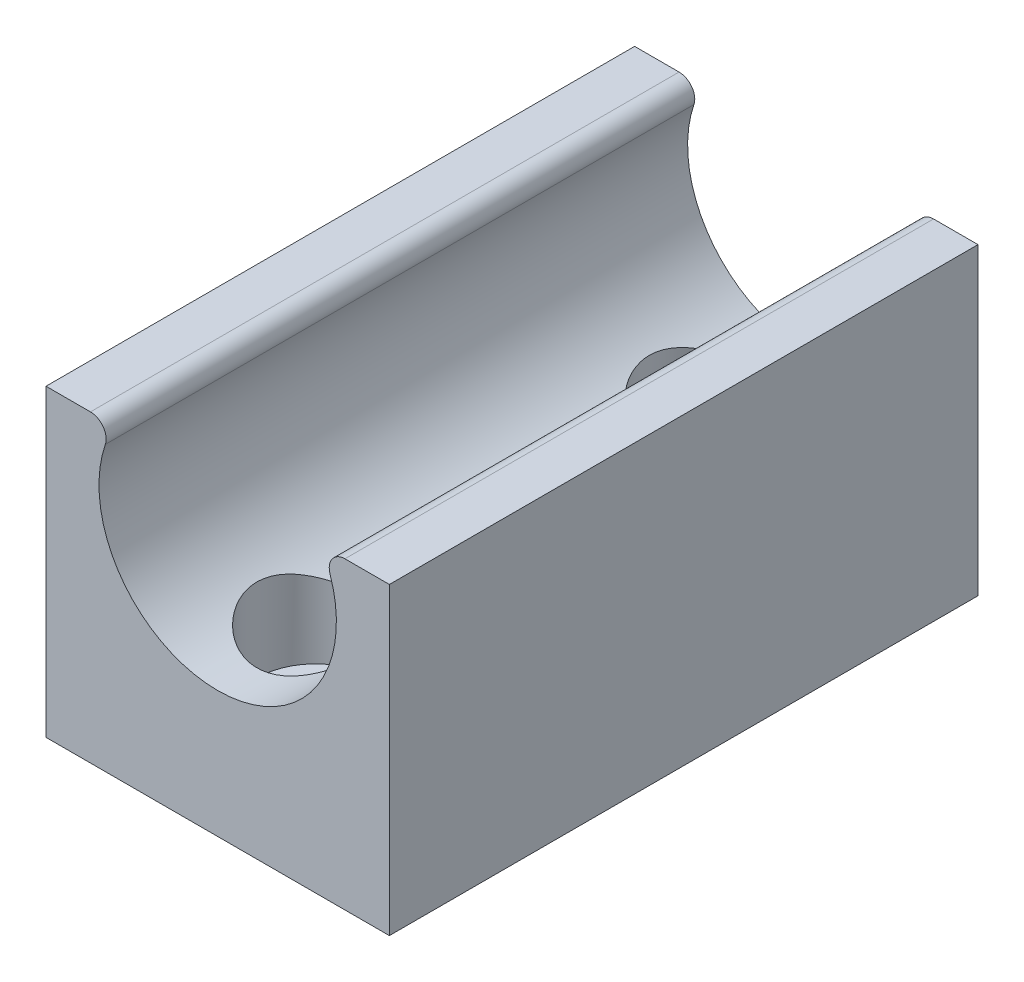
ISO-10303-21;
HEADER;
FILE_DESCRIPTION(('STEP AP214'),'2;1');
FILE_NAME('part.step','',(''),(''),'','','');
FILE_SCHEMA(('AUTOMOTIVE_DESIGN { 1 0 10303 214 1 1 1 1 }'));
ENDSEC;
DATA;
#1=APPLICATION_CONTEXT('core data for automotive mechanical design processes');
#2=APPLICATION_PROTOCOL_DEFINITION('international standard','automotive_design',2000,#1);
#3=PRODUCT_CONTEXT('',#1,'mechanical');
#4=PRODUCT('Part','Part','',(#3));
#5=PRODUCT_RELATED_PRODUCT_CATEGORY('part','',(#4));
#6=PRODUCT_DEFINITION_FORMATION('','',#4);
#7=PRODUCT_DEFINITION_CONTEXT('part definition',#1,'design');
#8=PRODUCT_DEFINITION('design','',#6,#7);
#9=PRODUCT_DEFINITION_SHAPE('','',#8);
#10=(LENGTH_UNIT() NAMED_UNIT(*) SI_UNIT(.MILLI.,.METRE.));
#11=(NAMED_UNIT(*) PLANE_ANGLE_UNIT() SI_UNIT($,.RADIAN.));
#12=(NAMED_UNIT(*) SI_UNIT($,.STERADIAN.) SOLID_ANGLE_UNIT());
#13=UNCERTAINTY_MEASURE_WITH_UNIT(LENGTH_MEASURE(1.E-05),#10,'distance_accuracy_value','');
#14=(GEOMETRIC_REPRESENTATION_CONTEXT(3) GLOBAL_UNCERTAINTY_ASSIGNED_CONTEXT((#13)) GLOBAL_UNIT_ASSIGNED_CONTEXT((#10,
#11,#12)) REPRESENTATION_CONTEXT('',''));
#15=CARTESIAN_POINT('',(0.,0.,0.));
#16=DIRECTION('',(0.,0.,1.));
#17=DIRECTION('',(1.,0.,0.));
#18=AXIS2_PLACEMENT_3D('',#15,#16,#17);
#19=CARTESIAN_POINT('',(-8.75,-7.75,30.));
#20=DIRECTION('',(1.,0.,0.));
#21=DIRECTION('',(0.,0.,-1.));
#22=AXIS2_PLACEMENT_3D('',#19,#20,#21);
#23=PLANE('',#22);
#24=DIRECTION('',(0.,-1.,0.));
#25=VECTOR('',#24,1.);
#26=CARTESIAN_POINT('',(-8.75,-7.75,0.));
#27=LINE('',#26,#25);
#28=CARTESIAN_POINT('',(-8.75,7.75,0.));
#29=VERTEX_POINT('',#28);
#30=CARTESIAN_POINT('',(-8.75,-7.75,0.));
#31=VERTEX_POINT('',#30);
#32=EDGE_CURVE('E128',#29,#31,#27,.T.);
#33=ORIENTED_EDGE('',*,*,#32,.T.);
#34=DIRECTION('',(0.,0.,-1.));
#35=VECTOR('',#34,1.);
#36=CARTESIAN_POINT('',(-8.75,-7.75,30.));
#37=LINE('',#36,#35);
#38=CARTESIAN_POINT('',(-8.75,-7.75,30.));
#39=VERTEX_POINT('',#38);
#40=EDGE_CURVE('E111',#39,#31,#37,.T.);
#41=ORIENTED_EDGE('',*,*,#40,.F.);
#42=DIRECTION('',(0.,-1.,0.));
#43=VECTOR('',#42,1.);
#44=CARTESIAN_POINT('',(-8.75,-7.75,30.));
#45=LINE('',#44,#43);
#46=CARTESIAN_POINT('',(-8.75,7.75,30.));
#47=VERTEX_POINT('',#46);
#48=EDGE_CURVE('E117',#47,#39,#45,.T.);
#49=ORIENTED_EDGE('',*,*,#48,.F.);
#50=DIRECTION('',(0.,0.,-1.));
#51=VECTOR('',#50,1.);
#52=CARTESIAN_POINT('',(-8.75,7.75,30.));
#53=LINE('',#52,#51);
#54=EDGE_CURVE('E210',#47,#29,#53,.T.);
#55=ORIENTED_EDGE('',*,*,#54,.T.);
#56=EDGE_LOOP('',(#33,#41,#49,#55));
#57=FACE_BOUND('',#56,.T.);
#58=ADVANCED_FACE('F37',(#57),#23,.F.);
#59=CARTESIAN_POINT('',(8.75,-7.75,30.));
#60=DIRECTION('',(0.,1.,0.));
#61=DIRECTION('',(-1.,0.,0.));
#62=AXIS2_PLACEMENT_3D('',#59,#60,#61);
#63=PLANE('',#62);
#64=CARTESIAN_POINT('',(0.,-7.75,5.));
#65=DIRECTION('',(0.,1.,0.));
#66=DIRECTION('',(-1.,0.,0.));
#67=AXIS2_PLACEMENT_3D('',#64,#65,#66);
#68=CIRCLE('',#67,1.55);
#69=CARTESIAN_POINT('',(-1.55,-7.75,5.));
#70=VERTEX_POINT('',#69);
#71=EDGE_CURVE('E241',#70,#70,#68,.T.);
#72=ORIENTED_EDGE('',*,*,#71,.T.);
#73=EDGE_LOOP('',(#72));
#74=FACE_BOUND('',#73,.T.);
#75=CARTESIAN_POINT('',(0.,-7.75,25.));
#76=DIRECTION('',(0.,1.,0.));
#77=DIRECTION('',(-1.,0.,0.));
#78=AXIS2_PLACEMENT_3D('',#75,#76,#77);
#79=CIRCLE('',#78,1.55);
#80=CARTESIAN_POINT('',(-1.55,-7.75,25.));
#81=VERTEX_POINT('',#80);
#82=EDGE_CURVE('E238',#81,#81,#79,.T.);
#83=ORIENTED_EDGE('',*,*,#82,.T.);
#84=EDGE_LOOP('',(#83));
#85=FACE_BOUND('',#84,.T.);
#86=DIRECTION('',(1.,0.,0.));
#87=VECTOR('',#86,1.);
#88=CARTESIAN_POINT('',(8.75,-7.75,0.));
#89=LINE('',#88,#87);
#90=CARTESIAN_POINT('',(8.75,-7.75,0.));
#91=VERTEX_POINT('',#90);
#92=EDGE_CURVE('E216',#31,#91,#89,.T.);
#93=ORIENTED_EDGE('',*,*,#92,.T.);
#94=DIRECTION('',(0.,0.,-1.));
#95=VECTOR('',#94,1.);
#96=CARTESIAN_POINT('',(8.75,-7.75,30.));
#97=LINE('',#96,#95);
#98=CARTESIAN_POINT('',(8.75,-7.75,30.));
#99=VERTEX_POINT('',#98);
#100=EDGE_CURVE('E114',#99,#91,#97,.T.);
#101=ORIENTED_EDGE('',*,*,#100,.F.);
#102=DIRECTION('',(1.,0.,0.));
#103=VECTOR('',#102,1.);
#104=CARTESIAN_POINT('',(8.75,-7.75,30.));
#105=LINE('',#104,#103);
#106=EDGE_CURVE('E107',#39,#99,#105,.T.);
#107=ORIENTED_EDGE('',*,*,#106,.F.);
#108=ORIENTED_EDGE('',*,*,#40,.T.);
#109=EDGE_LOOP('',(#93,#101,#107,#108));
#110=FACE_BOUND('',#109,.T.);
#111=ADVANCED_FACE('F109',(#74,#85,#110),#63,.F.);
#112=CARTESIAN_POINT('',(8.75,-7.75,30.));
#113=DIRECTION('',(-1.,0.,0.));
#114=DIRECTION('',(0.,0.,1.));
#115=AXIS2_PLACEMENT_3D('',#112,#113,#114);
#116=PLANE('',#115);
#117=DIRECTION('',(0.,1.,0.));
#118=VECTOR('',#117,1.);
#119=CARTESIAN_POINT('',(8.75,-7.75,0.));
#120=LINE('',#119,#118);
#121=CARTESIAN_POINT('',(8.75,7.75,0.));
#122=VERTEX_POINT('',#121);
#123=EDGE_CURVE('E218',#91,#122,#120,.T.);
#124=ORIENTED_EDGE('',*,*,#123,.T.);
#125=DIRECTION('',(0.,0.,-1.));
#126=VECTOR('',#125,1.);
#127=CARTESIAN_POINT('',(8.75,7.75,30.));
#128=LINE('',#127,#126);
#129=CARTESIAN_POINT('',(8.75,7.75,30.));
#130=VERTEX_POINT('',#129);
#131=EDGE_CURVE('E133',#130,#122,#128,.T.);
#132=ORIENTED_EDGE('',*,*,#131,.F.);
#133=DIRECTION('',(0.,1.,0.));
#134=VECTOR('',#133,1.);
#135=CARTESIAN_POINT('',(8.75,-7.75,30.));
#136=LINE('',#135,#134);
#137=EDGE_CURVE('E116',#99,#130,#136,.T.);
#138=ORIENTED_EDGE('',*,*,#137,.F.);
#139=ORIENTED_EDGE('',*,*,#100,.T.);
#140=EDGE_LOOP('',(#124,#132,#138,#139));
#141=FACE_BOUND('',#140,.T.);
#142=ADVANCED_FACE('F190',(#141),#116,.F.);
#143=CARTESIAN_POINT('',(8.75,7.75,30.));
#144=DIRECTION('',(0.,-1.,0.));
#145=DIRECTION('',(1.,0.,0.));
#146=AXIS2_PLACEMENT_3D('',#143,#144,#145);
#147=PLANE('',#146);
#148=DIRECTION('',(-1.,0.,0.));
#149=VECTOR('',#148,1.);
#150=CARTESIAN_POINT('',(8.75,7.75,0.));
#151=LINE('',#150,#149);
#152=CARTESIAN_POINT('',(6.48484038670801,7.75,0.));
#153=VERTEX_POINT('',#152);
#154=EDGE_CURVE('E220',#122,#153,#151,.T.);
#155=ORIENTED_EDGE('',*,*,#154,.T.);
#156=DIRECTION('',(0.,0.,-1.));
#157=VECTOR('',#156,1.);
#158=CARTESIAN_POINT('',(6.48484038670801,7.75,30.));
#159=LINE('',#158,#157);
#160=CARTESIAN_POINT('',(6.48484038670801,7.75,30.));
#161=VERTEX_POINT('',#160);
#162=EDGE_CURVE('E62',#153,#161,#159,.F.);
#163=ORIENTED_EDGE('',*,*,#162,.T.);
#164=DIRECTION('',(-1.,0.,0.));
#165=VECTOR('',#164,1.);
#166=CARTESIAN_POINT('',(8.75,7.75,30.));
#167=LINE('',#166,#165);
#168=EDGE_CURVE('E204',#130,#161,#167,.T.);
#169=ORIENTED_EDGE('',*,*,#168,.F.);
#170=ORIENTED_EDGE('',*,*,#131,.T.);
#171=EDGE_LOOP('',(#155,#163,#169,#170));
#172=FACE_BOUND('',#171,.T.);
#173=ADVANCED_FACE('F183',(#172),#147,.F.);
#174=CARTESIAN_POINT('',(0.,4.74334072432542,30.));
#175=DIRECTION('',(0.,0.,-1.));
#176=DIRECTION('',(-1.,0.,0.));
#177=AXIS2_PLACEMENT_3D('',#174,#175,#176);
#178=CYLINDRICAL_SURFACE('',#177,6.05);
#179=CARTESIAN_POINT('',(-3.,-0.510467418345945,5.));
#180=CARTESIAN_POINT('',(-2.99999906809474,-0.510468420860445,4.92169958919087));
#181=CARTESIAN_POINT('',(-2.99692823095395,-0.512225857019895,4.8433884027717));
#182=CARTESIAN_POINT('',(-2.98469593638342,-0.519180558374638,4.68738634838371));
#183=CARTESIAN_POINT('',(-2.97553158010728,-0.524379460760186,4.60969579347636));
#184=CARTESIAN_POINT('',(-2.93900669661293,-0.544908680843851,4.37823264692065));
#185=CARTESIAN_POINT('',(-2.90261462142551,-0.565171017829793,4.22621080798807));
#186=CARTESIAN_POINT('',(-2.80775426000344,-0.615934930005664,3.93213582389355));
#187=CARTESIAN_POINT('',(-2.7494018083673,-0.646382688012097,3.79003493192759));
#188=CARTESIAN_POINT('',(-2.6126308262436,-0.713991040877364,3.51764153154145));
#189=CARTESIAN_POINT('',(-2.53421149634938,-0.751151903149601,3.38734949383212));
#190=CARTESIAN_POINT('',(-2.35207791908091,-0.831684826026814,3.13065008506965));
#191=CARTESIAN_POINT('',(-2.24682870416992,-0.875316190133694,3.0054133867091));
#192=CARTESIAN_POINT('',(-2.01721665974256,-0.961778990100263,2.77345914021974));
#193=CARTESIAN_POINT('',(-1.89284448548842,-1.00461002332697,2.66675070079675));
#194=CARTESIAN_POINT('',(-1.6184786687261,-1.08803015934491,2.46799246796855));
#195=CARTESIAN_POINT('',(-1.46733550477812,-1.12828449124294,2.37737580991346));
#196=CARTESIAN_POINT('',(-1.14958038611186,-1.19865972325338,2.22338801387059));
#197=CARTESIAN_POINT('',(-0.982978114604601,-1.22878691281416,2.15999995877159));
#198=CARTESIAN_POINT('',(-0.651423860859738,-1.27364660956282,2.06688241456696));
#199=CARTESIAN_POINT('',(-0.487176521968722,-1.28931108372145,2.035103075595));
#200=CARTESIAN_POINT('',(-0.15499131346126,-1.30695497814249,1.99936086132741));
#201=CARTESIAN_POINT('',(0.0129443057167113,-1.30894252289321,1.99538147204299));
#202=CARTESIAN_POINT('',(0.332354445423705,-1.29945611499654,2.0145461562578));
#203=CARTESIAN_POINT('',(0.484007962523601,-1.28911942101921,2.035398591201));
#204=CARTESIAN_POINT('',(0.781333146292697,-1.25785659100831,2.09954285160153));
#205=CARTESIAN_POINT('',(0.927004365054746,-1.23692966361902,2.14283635397461));
#206=CARTESIAN_POINT('',(1.21079360349512,-1.18604146430231,2.25093276304642));
#207=CARTESIAN_POINT('',(1.3487772176401,-1.15595773393687,2.31602850637883));
#208=CARTESIAN_POINT('',(1.61219900252273,-1.08947997144428,2.46548322192162));
#209=CARTESIAN_POINT('',(1.73763263516921,-1.05308366959321,2.5498491263071));
#210=CARTESIAN_POINT('',(1.98489139887648,-0.973399023566615,2.74451485261607));
#211=CARTESIAN_POINT('',(2.10528603368982,-0.929784470629818,2.85650064321701));
#212=CARTESIAN_POINT('',(2.32634259539988,-0.84278218002394,3.09866712688479));
#213=CARTESIAN_POINT('',(2.42698977332746,-0.799394635265103,3.22886129604987));
#214=CARTESIAN_POINT('',(2.61181236808333,-0.714856277507947,3.51375228475325));
#215=CARTESIAN_POINT('',(2.69458875370377,-0.674008529712046,3.66946515757608));
#216=CARTESIAN_POINT('',(2.79773152700655,-0.621050067610582,3.91347968465842));
#217=CARTESIAN_POINT('',(2.82861305914927,-0.604780250734139,3.99657713022711));
#218=CARTESIAN_POINT('',(2.88302399044353,-0.57564672861484,4.16570628855268));
#219=CARTESIAN_POINT('',(2.90655788697889,-0.562780940552876,4.25173617049391));
#220=CARTESIAN_POINT('',(2.94439298418655,-0.541872606173172,4.41919564061344));
#221=CARTESIAN_POINT('',(2.95927300565854,-0.533531185379414,4.50045769692463));
#222=CARTESIAN_POINT('',(2.98229098239219,-0.52055666332928,4.66418766032683));
#223=CARTESIAN_POINT('',(2.99043241562099,-0.515921649138391,4.74665492298273));
#224=CARTESIAN_POINT('',(2.99985479803174,-0.510553378553936,4.9120840314402));
#225=CARTESIAN_POINT('',(3.00113816073897,-0.509818749518585,4.99504569295921));
#226=CARTESIAN_POINT('',(2.99683992542914,-0.512270371357852,5.16070691994721));
#227=CARTESIAN_POINT('',(2.99125877282282,-0.515456367838882,5.24340650207241));
#228=CARTESIAN_POINT('',(2.96623633903531,-0.529641045432653,5.47242698393079));
#229=CARTESIAN_POINT('',(2.9393561847828,-0.544808245301001,5.61775608758309));
#230=CARTESIAN_POINT('',(2.86511831894805,-0.585387234984429,5.90147917235802));
#231=CARTESIAN_POINT('',(2.81775411138511,-0.610802274460164,6.0398709379369));
#232=CARTESIAN_POINT('',(2.70158216238737,-0.67038210339218,6.31320616371009));
#233=CARTESIAN_POINT('',(2.63188161552255,-0.704898088218059,6.44769186293141));
#234=CARTESIAN_POINT('',(2.47379628699685,-0.778473022231752,6.70382415113317));
#235=CARTESIAN_POINT('',(2.38540193064305,-0.817534294819843,6.82546411266343));
#236=CARTESIAN_POINT('',(2.17966693882562,-0.901600089602028,7.06818278242263));
#237=CARTESIAN_POINT('',(2.0600991799859,-0.94674258526617,7.18733486504638));
#238=CARTESIAN_POINT('',(1.80193286915295,-1.03369018286212,7.40447397825601));
#239=CARTESIAN_POINT('',(1.66332824552305,-1.07549421326621,7.5024542305182));
#240=CARTESIAN_POINT('',(1.3662795721512,-1.15240878811595,7.67649285211116));
#241=CARTESIAN_POINT('',(1.20742925954395,-1.18732796594369,7.75194834478087));
#242=CARTESIAN_POINT('',(0.877061019214468,-1.24508872420463,7.87432043564501));
#243=CARTESIAN_POINT('',(0.705554178032911,-1.26794073510084,7.92126168590921));
#244=CARTESIAN_POINT('',(0.371551000325058,-1.29735246965967,7.98128875886027));
#245=CARTESIAN_POINT('',(0.209650096715321,-1.30520289298801,7.99706115372735));
#246=CARTESIAN_POINT('',(-0.114649777075978,-1.30774271718464,8.00218671215331));
#247=CARTESIAN_POINT('',(-0.27704856013795,-1.30243657157682,7.99154881564504));
#248=CARTESIAN_POINT('',(-0.586778482700864,-1.28001209720235,7.94595117695327));
#249=CARTESIAN_POINT('',(-0.734408053014391,-1.26367303386849,7.91259479624071));
#250=CARTESIAN_POINT('',(-1.02174485627361,-1.22152619531595,7.82464556498565));
#251=CARTESIAN_POINT('',(-1.16145093163361,-1.19571704065419,7.7700496205521));
#252=CARTESIAN_POINT('',(-1.43574865278081,-1.13557895005961,7.63870224312811));
#253=CARTESIAN_POINT('',(-1.56985828254568,-1.10092999846004,7.56109522952421));
#254=CARTESIAN_POINT('',(-1.82371481519903,-1.02676161644591,7.38700154070093));
#255=CARTESIAN_POINT('',(-1.94345506734849,-0.987239947763284,7.2905061771253));
#256=CARTESIAN_POINT('',(-2.17753140543736,-0.902704003554632,7.07042250074851));
#257=CARTESIAN_POINT('',(-2.2901859543099,-0.857531170488277,6.9451052704169));
#258=CARTESIAN_POINT('',(-2.49350662440991,-0.770025337517421,6.67653596788057));
#259=CARTESIAN_POINT('',(-2.58415383762679,-0.727694802053138,6.53326863258302));
#260=CARTESIAN_POINT('',(-2.70266184938719,-0.669619226334951,6.30509672838674));
#261=CARTESIAN_POINT('',(-2.73965739745577,-0.650934064457997,6.22556757982067));
#262=CARTESIAN_POINT('',(-2.80670646717209,-0.61635342321053,6.06306692411298));
#263=CARTESIAN_POINT('',(-2.8367635615506,-0.600456509140077,5.98009721465641));
#264=CARTESIAN_POINT('',(-2.88950286251377,-0.572124344840971,5.81151459588914));
#265=CARTESIAN_POINT('',(-2.91220409038982,-0.559680178452798,5.72590914097619));
#266=CARTESIAN_POINT('',(-2.94999720196722,-0.538750370928166,5.55260406566714));
#267=CARTESIAN_POINT('',(-2.96509443701472,-0.530261946235029,5.46490596363331));
#268=CARTESIAN_POINT('',(-2.9841585341751,-0.519488947340425,5.31424298296345));
#269=CARTESIAN_POINT('',(-2.99009363222024,-0.51611368867549,5.25159698145114));
#270=CARTESIAN_POINT('',(-2.99801486981297,-0.511602447314145,5.1259696588871));
#271=CARTESIAN_POINT('',(-3.00000074966584,-0.51046661187891,5.06298831605687));
#272=CARTESIAN_POINT('',(-3.,-0.510467418345945,5.));
#273=B_SPLINE_CURVE_WITH_KNOTS('',3,(#179,#180,#181,#182,#183,#184,#185,#186,#187,#188,#189,
#190,#191,#192,#193,#194,#195,#196,#197,#198,#199,#200,#201,#202,#203,#204,#205,#206,#207,#208,
#209,#210,#211,#212,#213,#214,#215,#216,#217,#218,#219,#220,#221,#222,#223,#224,#225,#226,#227,
#228,#229,#230,#231,#232,#233,#234,#235,#236,#237,#238,#239,#240,#241,#242,#243,#244,#245,#246,
#247,#248,#249,#250,#251,#252,#253,#254,#255,#256,#257,#258,#259,#260,#261,#262,#263,#264,#265,
#266,#267,#268,#269,#270,#271,#272),.UNSPECIFIED.,.T.,.F.,(4,2,2,2,2,2,2,2,2,2,2,2,2,2,2,2,2,2,
2,2,2,2,2,2,2,2,2,2,2,2,2,2,2,2,2,2,2,2,2,2,2,2,2,2,2,2,4),(0.,0.234832216291769,
0.469776228416026,0.940084921369962,1.40794687267444,1.87582746515457,2.38162825856337,
2.88767700975197,3.42713981376168,3.96626696343198,4.46756050795178,4.96855624400314,
5.42668515066377,5.88484829608603,6.34943002572839,6.81417914620369,7.3223226734741,
7.83084428994023,8.37073413562579,8.64079160168459,8.91068344385044,9.15943377973968,
9.40805564867155,9.65659001563011,9.90510825704555,10.3486118593694,10.792256210488,
11.256480421302,11.7209429792526,12.2427974264193,12.7648187025478,13.2997656797885,
13.8342495063932,14.320212475525,14.8060109677164,15.2606580113594,15.7153713066187,
16.1897374121279,16.664322233839,17.1854483024488,17.7070205341594,17.9757512635118,
18.2443433085238,18.5122351623385,18.7799382216341,18.9688352289957,19.1577446575321),.UNSPECIFIED.);
#274=CARTESIAN_POINT('',(-3.,-0.510467418345945,5.));
#275=VERTEX_POINT('',#274);
#276=EDGE_CURVE('E154',#275,#275,#273,.T.);
#277=ORIENTED_EDGE('',*,*,#276,.T.);
#278=EDGE_LOOP('',(#277));
#279=FACE_BOUND('',#278,.T.);
#280=CARTESIAN_POINT('',(-3.,-0.510467418345945,25.));
#281=CARTESIAN_POINT('',(-2.99999906809474,-0.510468420860445,24.9216995891909));
#282=CARTESIAN_POINT('',(-2.99692823095395,-0.512225857019895,24.8433884027717));
#283=CARTESIAN_POINT('',(-2.98469593638342,-0.519180558374637,24.6873863483837));
#284=CARTESIAN_POINT('',(-2.97553158010728,-0.524379460760185,24.6096957934764));
#285=CARTESIAN_POINT('',(-2.93900669661293,-0.54490868084385,24.3782326469206));
#286=CARTESIAN_POINT('',(-2.90261462142551,-0.565171017829793,24.2262108079881));
#287=CARTESIAN_POINT('',(-2.80775426000344,-0.615934930005664,23.9321358238935));
#288=CARTESIAN_POINT('',(-2.7494018083673,-0.646382688012097,23.7900349319276));
#289=CARTESIAN_POINT('',(-2.6126308262436,-0.713991040877364,23.5176415315415));
#290=CARTESIAN_POINT('',(-2.53421149634938,-0.7511519031496,23.3873494938321));
#291=CARTESIAN_POINT('',(-2.35207791908091,-0.831684826026812,23.1306500850696));
#292=CARTESIAN_POINT('',(-2.24682870416992,-0.875316190133693,23.0054133867091));
#293=CARTESIAN_POINT('',(-2.01721665974257,-0.961778990100261,22.7734591402197));
#294=CARTESIAN_POINT('',(-1.89284448548842,-1.00461002332697,22.6667507007967));
#295=CARTESIAN_POINT('',(-1.6184786687261,-1.08803015934491,22.4679924679685));
#296=CARTESIAN_POINT('',(-1.46733550477812,-1.12828449124294,22.3773758099135));
#297=CARTESIAN_POINT('',(-1.14958038611187,-1.19865972325338,22.2233880138706));
#298=CARTESIAN_POINT('',(-0.982978114604605,-1.22878691281416,22.1599999587716));
#299=CARTESIAN_POINT('',(-0.651423860859742,-1.27364660956282,22.066882414567));
#300=CARTESIAN_POINT('',(-0.487176521968726,-1.28931108372145,22.035103075595));
#301=CARTESIAN_POINT('',(-0.154991313461263,-1.30695497814249,21.9993608613274));
#302=CARTESIAN_POINT('',(0.0129443057167084,-1.30894252289321,21.995381472043));
#303=CARTESIAN_POINT('',(0.332354445423702,-1.29945611499654,22.0145461562578));
#304=CARTESIAN_POINT('',(0.484007962523599,-1.28911942101921,22.035398591201));
#305=CARTESIAN_POINT('',(0.781333146292694,-1.25785659100831,22.0995428516015));
#306=CARTESIAN_POINT('',(0.927004365054744,-1.23692966361902,22.1428363539746));
#307=CARTESIAN_POINT('',(1.21079360349512,-1.18604146430231,22.2509327630464));
#308=CARTESIAN_POINT('',(1.3487772176401,-1.15595773393687,22.3160285063788));
#309=CARTESIAN_POINT('',(1.61219900252273,-1.08947997144428,22.4654832219216));
#310=CARTESIAN_POINT('',(1.73763263516921,-1.05308366959321,22.5498491263071));
#311=CARTESIAN_POINT('',(1.98489139887648,-0.973399023566615,22.7445148526161));
#312=CARTESIAN_POINT('',(2.10528603368982,-0.929784470629819,22.856500643217));
#313=CARTESIAN_POINT('',(2.32634259539988,-0.842782180023942,23.0986671268848));
#314=CARTESIAN_POINT('',(2.42698977332746,-0.799394635265103,23.2288612960499));
#315=CARTESIAN_POINT('',(2.61181236808333,-0.714856277507948,23.5137522847532));
#316=CARTESIAN_POINT('',(2.69458875370377,-0.674008529712048,23.6694651575761));
#317=CARTESIAN_POINT('',(2.79773152700655,-0.621050067610582,23.9134796846584));
#318=CARTESIAN_POINT('',(2.82861305914927,-0.604780250734138,23.9965771302271));
#319=CARTESIAN_POINT('',(2.88302399044353,-0.575646728614839,24.1657062885527));
#320=CARTESIAN_POINT('',(2.90655788697889,-0.562780940552877,24.2517361704939));
#321=CARTESIAN_POINT('',(2.94439298418655,-0.541872606173174,24.4191956406134));
#322=CARTESIAN_POINT('',(2.95927300565854,-0.533531185379415,24.5004576969246));
#323=CARTESIAN_POINT('',(2.98229098239219,-0.52055666332928,24.6641876603268));
#324=CARTESIAN_POINT('',(2.99043241562099,-0.515921649138392,24.7466549229827));
#325=CARTESIAN_POINT('',(2.99985479803174,-0.510553378553937,24.9120840314402));
#326=CARTESIAN_POINT('',(3.00113816073897,-0.509818749518586,24.9950456929592));
#327=CARTESIAN_POINT('',(2.99683992542914,-0.512270371357853,25.1607069199472));
#328=CARTESIAN_POINT('',(2.99125877282282,-0.515456367838883,25.2434065020724));
#329=CARTESIAN_POINT('',(2.96623633903531,-0.529641045432654,25.4724269839308));
#330=CARTESIAN_POINT('',(2.9393561847828,-0.544808245301,25.6177560875831));
#331=CARTESIAN_POINT('',(2.86511831894805,-0.585387234984428,25.901479172358));
#332=CARTESIAN_POINT('',(2.81775411138511,-0.610802274460164,26.0398709379369));
#333=CARTESIAN_POINT('',(2.70158216238737,-0.67038210339218,26.3132061637101));
#334=CARTESIAN_POINT('',(2.63188161552255,-0.704898088218057,26.4476918629314));
#335=CARTESIAN_POINT('',(2.47379628699685,-0.778473022231751,26.7038241511332));
#336=CARTESIAN_POINT('',(2.38540193064305,-0.817534294819842,26.8254641126634));
#337=CARTESIAN_POINT('',(2.17966693882562,-0.901600089602028,27.0681827824226));
#338=CARTESIAN_POINT('',(2.0600991799859,-0.94674258526617,27.1873348650464));
#339=CARTESIAN_POINT('',(1.80193286915295,-1.03369018286212,27.404473978256));
#340=CARTESIAN_POINT('',(1.66332824552305,-1.07549421326621,27.5024542305182));
#341=CARTESIAN_POINT('',(1.3662795721512,-1.15240878811594,27.6764928521112));
#342=CARTESIAN_POINT('',(1.20742925954395,-1.18732796594369,27.7519483447809));
#343=CARTESIAN_POINT('',(0.877061019214469,-1.24508872420463,27.874320435645));
#344=CARTESIAN_POINT('',(0.705554178032912,-1.26794073510084,27.9212616859092));
#345=CARTESIAN_POINT('',(0.37155100032506,-1.29735246965968,27.9812887588603));
#346=CARTESIAN_POINT('',(0.209650096715322,-1.30520289298801,27.9970611537273));
#347=CARTESIAN_POINT('',(-0.114649777075976,-1.30774271718464,28.0021867121533));
#348=CARTESIAN_POINT('',(-0.277048560137948,-1.30243657157682,27.991548815645));
#349=CARTESIAN_POINT('',(-0.586778482700861,-1.28001209720235,27.9459511769533));
#350=CARTESIAN_POINT('',(-0.734408053014389,-1.26367303386849,27.9125947962407));
#351=CARTESIAN_POINT('',(-1.0217448562736,-1.22152619531595,27.8246455649857));
#352=CARTESIAN_POINT('',(-1.16145093163361,-1.19571704065419,27.7700496205521));
#353=CARTESIAN_POINT('',(-1.43574865278081,-1.13557895005961,27.6387022431281));
#354=CARTESIAN_POINT('',(-1.56985828254568,-1.10092999846004,27.5610952295242));
#355=CARTESIAN_POINT('',(-1.82371481519903,-1.02676161644591,27.3870015407009));
#356=CARTESIAN_POINT('',(-1.94345506734848,-0.987239947763285,27.2905061771253));
#357=CARTESIAN_POINT('',(-2.17753140543736,-0.902704003554633,27.0704225007485));
#358=CARTESIAN_POINT('',(-2.2901859543099,-0.857531170488277,26.9451052704169));
#359=CARTESIAN_POINT('',(-2.49350662440991,-0.770025337517422,26.6765359678806));
#360=CARTESIAN_POINT('',(-2.58415383762679,-0.72769480205314,26.533268632583));
#361=CARTESIAN_POINT('',(-2.70266184938719,-0.669619226334952,26.3050967283867));
#362=CARTESIAN_POINT('',(-2.73965739745577,-0.650934064457998,26.2255675798207));
#363=CARTESIAN_POINT('',(-2.80670646717209,-0.616353423210531,26.063066924113));
#364=CARTESIAN_POINT('',(-2.8367635615506,-0.600456509140079,25.9800972146564));
#365=CARTESIAN_POINT('',(-2.88950286251377,-0.572124344840973,25.8115145958891));
#366=CARTESIAN_POINT('',(-2.91220409038982,-0.5596801784528,25.7259091409762));
#367=CARTESIAN_POINT('',(-2.94999720196722,-0.538750370928166,25.5526040656671));
#368=CARTESIAN_POINT('',(-2.96509443701472,-0.530261946235029,25.4649059636333));
#369=CARTESIAN_POINT('',(-2.9841585341751,-0.519488947340425,25.3142429829635));
#370=CARTESIAN_POINT('',(-2.99009363222024,-0.51611368867549,25.2515969814511));
#371=CARTESIAN_POINT('',(-2.99801486981297,-0.511602447314145,25.1259696588871));
#372=CARTESIAN_POINT('',(-3.00000074966584,-0.51046661187891,25.0629883160569));
#373=CARTESIAN_POINT('',(-3.,-0.510467418345945,25.));
#374=B_SPLINE_CURVE_WITH_KNOTS('',3,(#280,#281,#282,#283,#284,#285,#286,#287,#288,#289,#290,
#291,#292,#293,#294,#295,#296,#297,#298,#299,#300,#301,#302,#303,#304,#305,#306,#307,#308,#309,
#310,#311,#312,#313,#314,#315,#316,#317,#318,#319,#320,#321,#322,#323,#324,#325,#326,#327,#328,
#329,#330,#331,#332,#333,#334,#335,#336,#337,#338,#339,#340,#341,#342,#343,#344,#345,#346,#347,
#348,#349,#350,#351,#352,#353,#354,#355,#356,#357,#358,#359,#360,#361,#362,#363,#364,#365,#366,
#367,#368,#369,#370,#371,#372,#373),.UNSPECIFIED.,.T.,.F.,(4,2,2,2,2,2,2,2,2,2,2,2,2,2,2,2,2,2,
2,2,2,2,2,2,2,2,2,2,2,2,2,2,2,2,2,2,2,2,2,2,2,2,2,2,2,2,4),(0.,0.234832216291769,
0.469776228416024,0.94008492136996,1.40794687267444,1.87582746515457,2.38162825856336,
2.88767700975196,3.42713981376167,3.96626696343198,4.46756050795177,4.96855624400314,
5.42668515066376,5.88484829608603,6.34943002572838,6.81417914620369,7.3223226734741,
7.83084428994023,8.37073413562579,8.64079160168458,8.91068344385043,9.15943377973968,
9.40805564867155,9.6565900156301,9.90510825704555,10.3486118593694,10.792256210488,
11.256480421302,11.7209429792526,12.2427974264193,12.7648187025477,13.2997656797885,
13.8342495063932,14.320212475525,14.8060109677164,15.2606580113594,15.7153713066187,
16.1897374121279,16.664322233839,17.1854483024488,17.7070205341594,17.9757512635118,
18.2443433085238,18.5122351623385,18.7799382216341,18.9688352289957,19.1577446575321),.UNSPECIFIED.);
#375=CARTESIAN_POINT('',(-3.,-0.510467418345945,25.));
#376=VERTEX_POINT('',#375);
#377=EDGE_CURVE('E146',#376,#376,#374,.T.);
#378=ORIENTED_EDGE('',*,*,#377,.T.);
#379=EDGE_LOOP('',(#378));
#380=FACE_BOUND('',#379,.T.);
#381=CARTESIAN_POINT('',(0.,4.74334072432542,30.));
#382=DIRECTION('',(0.,0.,-1.));
#383=DIRECTION('',(1.,0.,0.));
#384=AXIS2_PLACEMENT_3D('',#381,#382,#383);
#385=CIRCLE('',#384,6.05);
#386=CARTESIAN_POINT('',(5.7274867649027,6.69228796780443,30.));
#387=VERTEX_POINT('',#386);
#388=CARTESIAN_POINT('',(-5.7274867649027,6.69228796780443,30.));
#389=VERTEX_POINT('',#388);
#390=EDGE_CURVE('E203',#387,#389,#385,.T.);
#391=ORIENTED_EDGE('',*,*,#390,.F.);
#392=DIRECTION('',(0.,0.,-1.));
#393=VECTOR('',#392,1.);
#394=CARTESIAN_POINT('',(5.7274867649027,6.69228796780443,30.));
#395=LINE('',#394,#393);
#396=CARTESIAN_POINT('',(5.7274867649027,6.69228796780443,0.));
#397=VERTEX_POINT('',#396);
#398=EDGE_CURVE('E131',#387,#397,#395,.T.);
#399=ORIENTED_EDGE('',*,*,#398,.T.);
#400=CARTESIAN_POINT('',(0.,4.74334072432542,0.));
#401=DIRECTION('',(0.,0.,-1.));
#402=DIRECTION('',(1.,0.,0.));
#403=AXIS2_PLACEMENT_3D('',#400,#401,#402);
#404=CIRCLE('',#403,6.05);
#405=CARTESIAN_POINT('',(-5.7274867649027,6.69228796780443,0.));
#406=VERTEX_POINT('',#405);
#407=EDGE_CURVE('E222',#397,#406,#404,.T.);
#408=ORIENTED_EDGE('',*,*,#407,.T.);
#409=DIRECTION('',(0.,0.,-1.));
#410=VECTOR('',#409,1.);
#411=CARTESIAN_POINT('',(-5.7274867649027,6.69228796780443,30.));
#412=LINE('',#411,#410);
#413=EDGE_CURVE('E129',#406,#389,#412,.F.);
#414=ORIENTED_EDGE('',*,*,#413,.T.);
#415=EDGE_LOOP('',(#391,#399,#408,#414));
#416=FACE_BOUND('',#415,.T.);
#417=ADVANCED_FACE('F160',(#279,#380,#416),#178,.F.);
#418=CARTESIAN_POINT('',(-5.25,7.75,30.));
#419=DIRECTION('',(0.,-1.,0.));
#420=DIRECTION('',(1.,0.,0.));
#421=AXIS2_PLACEMENT_3D('',#418,#419,#420);
#422=PLANE('',#421);
#423=DIRECTION('',(-1.,0.,0.));
#424=VECTOR('',#423,1.);
#425=CARTESIAN_POINT('',(-5.25,7.75,30.));
#426=LINE('',#425,#424);
#427=CARTESIAN_POINT('',(-6.48484038670801,7.75,30.));
#428=VERTEX_POINT('',#427);
#429=EDGE_CURVE('E121',#428,#47,#426,.T.);
#430=ORIENTED_EDGE('',*,*,#429,.F.);
#431=DIRECTION('',(0.,0.,-1.));
#432=VECTOR('',#431,1.);
#433=CARTESIAN_POINT('',(-6.48484038670801,7.75,30.));
#434=LINE('',#433,#432);
#435=CARTESIAN_POINT('',(-6.48484038670801,7.75,0.));
#436=VERTEX_POINT('',#435);
#437=EDGE_CURVE('E11',#428,#436,#434,.T.);
#438=ORIENTED_EDGE('',*,*,#437,.T.);
#439=DIRECTION('',(-1.,0.,0.));
#440=VECTOR('',#439,1.);
#441=CARTESIAN_POINT('',(-5.25,7.75,0.));
#442=LINE('',#441,#440);
#443=EDGE_CURVE('E125',#436,#29,#442,.T.);
#444=ORIENTED_EDGE('',*,*,#443,.T.);
#445=ORIENTED_EDGE('',*,*,#54,.F.);
#446=EDGE_LOOP('',(#430,#438,#444,#445));
#447=FACE_BOUND('',#446,.T.);
#448=ADVANCED_FACE('F174',(#447),#422,.F.);
#449=CARTESIAN_POINT('',(0.,4.74334072432542,30.));
#450=DIRECTION('',(0.,0.,1.));
#451=DIRECTION('',(1.,0.,0.));
#452=AXIS2_PLACEMENT_3D('',#449,#450,#451);
#453=PLANE('',#452);
#454=ORIENTED_EDGE('',*,*,#168,.T.);
#455=CARTESIAN_POINT('',(6.48484038670801,6.95,30.));
#456=DIRECTION('',(0.,0.,1.));
#457=DIRECTION('',(1.,0.,0.));
#458=AXIS2_PLACEMENT_3D('',#455,#456,#457);
#459=CIRCLE('',#458,0.8);
#460=EDGE_CURVE('E46',#161,#387,#459,.T.);
#461=ORIENTED_EDGE('',*,*,#460,.T.);
#462=ORIENTED_EDGE('',*,*,#390,.T.);
#463=CARTESIAN_POINT('',(-6.48484038670801,6.95,30.));
#464=DIRECTION('',(0.,0.,1.));
#465=DIRECTION('',(1.,0.,0.));
#466=AXIS2_PLACEMENT_3D('',#463,#464,#465);
#467=CIRCLE('',#466,0.8);
#468=EDGE_CURVE('E54',#389,#428,#467,.T.);
#469=ORIENTED_EDGE('',*,*,#468,.T.);
#470=ORIENTED_EDGE('',*,*,#429,.T.);
#471=ORIENTED_EDGE('',*,*,#48,.T.);
#472=ORIENTED_EDGE('',*,*,#106,.T.);
#473=ORIENTED_EDGE('',*,*,#137,.T.);
#474=EDGE_LOOP('',(#454,#461,#462,#469,#470,#471,#472,#473));
#475=FACE_BOUND('',#474,.T.);
#476=ADVANCED_FACE('F120',(#475),#453,.T.);
#477=CARTESIAN_POINT('',(0.,4.74334072432542,0.));
#478=DIRECTION('',(0.,0.,1.));
#479=DIRECTION('',(1.,0.,0.));
#480=AXIS2_PLACEMENT_3D('',#477,#478,#479);
#481=PLANE('',#480);
#482=ORIENTED_EDGE('',*,*,#407,.F.);
#483=CARTESIAN_POINT('',(6.48484038670801,6.95,0.));
#484=DIRECTION('',(0.,0.,1.));
#485=DIRECTION('',(1.,0.,0.));
#486=AXIS2_PLACEMENT_3D('',#483,#484,#485);
#487=CIRCLE('',#486,0.8);
#488=EDGE_CURVE('E141',#397,#153,#487,.F.);
#489=ORIENTED_EDGE('',*,*,#488,.T.);
#490=ORIENTED_EDGE('',*,*,#154,.F.);
#491=ORIENTED_EDGE('',*,*,#123,.F.);
#492=ORIENTED_EDGE('',*,*,#92,.F.);
#493=ORIENTED_EDGE('',*,*,#32,.F.);
#494=ORIENTED_EDGE('',*,*,#443,.F.);
#495=CARTESIAN_POINT('',(-6.48484038670801,6.95,0.));
#496=DIRECTION('',(0.,0.,1.));
#497=DIRECTION('',(1.,0.,0.));
#498=AXIS2_PLACEMENT_3D('',#495,#496,#497);
#499=CIRCLE('',#498,0.8);
#500=EDGE_CURVE('E139',#436,#406,#499,.F.);
#501=ORIENTED_EDGE('',*,*,#500,.T.);
#502=EDGE_LOOP('',(#482,#489,#490,#491,#492,#493,#494,#501));
#503=FACE_BOUND('',#502,.T.);
#504=ADVANCED_FACE('F173',(#503),#481,.F.);
#505=CARTESIAN_POINT('',(6.48484038670801,6.95,30.));
#506=DIRECTION('',(0.,0.,-1.));
#507=DIRECTION('',(-1.,0.,0.));
#508=AXIS2_PLACEMENT_3D('',#505,#506,#507);
#509=CYLINDRICAL_SURFACE('',#508,0.8);
#510=ORIENTED_EDGE('',*,*,#460,.F.);
#511=ORIENTED_EDGE('',*,*,#162,.F.);
#512=ORIENTED_EDGE('',*,*,#488,.F.);
#513=ORIENTED_EDGE('',*,*,#398,.F.);
#514=EDGE_LOOP('',(#510,#511,#512,#513));
#515=FACE_BOUND('',#514,.T.);
#516=ADVANCED_FACE('F176',(#515),#509,.T.);
#517=CARTESIAN_POINT('',(-6.48484038670801,6.95,30.));
#518=DIRECTION('',(0.,0.,-1.));
#519=DIRECTION('',(-1.,0.,0.));
#520=AXIS2_PLACEMENT_3D('',#517,#518,#519);
#521=CYLINDRICAL_SURFACE('',#520,0.8);
#522=ORIENTED_EDGE('',*,*,#468,.F.);
#523=ORIENTED_EDGE('',*,*,#413,.F.);
#524=ORIENTED_EDGE('',*,*,#500,.F.);
#525=ORIENTED_EDGE('',*,*,#437,.F.);
#526=EDGE_LOOP('',(#522,#523,#524,#525));
#527=FACE_BOUND('',#526,.T.);
#528=ADVANCED_FACE('F39',(#527),#521,.T.);
#529=CARTESIAN_POINT('',(0.,-4.74999999999999,25.));
#530=DIRECTION('',(0.,1.,0.));
#531=DIRECTION('',(-1.,0.,0.));
#532=AXIS2_PLACEMENT_3D('',#529,#530,#531);
#533=CYLINDRICAL_SURFACE('',#532,3.);
#534=CARTESIAN_POINT('',(0.,-4.74999999999999,25.));
#535=DIRECTION('',(0.,1.,0.));
#536=DIRECTION('',(-1.,0.,0.));
#537=AXIS2_PLACEMENT_3D('',#534,#535,#536);
#538=CIRCLE('',#537,3.);
#539=CARTESIAN_POINT('',(-3.,-4.75,25.));
#540=VERTEX_POINT('',#539);
#541=EDGE_CURVE('E233',#540,#540,#538,.T.);
#542=ORIENTED_EDGE('',*,*,#541,.F.);
#543=EDGE_LOOP('',(#542));
#544=FACE_BOUND('',#543,.T.);
#545=ORIENTED_EDGE('',*,*,#377,.F.);
#546=EDGE_LOOP('',(#545));
#547=FACE_BOUND('',#546,.T.);
#548=ADVANCED_FACE('F164',(#544,#547),#533,.F.);
#549=CARTESIAN_POINT('',(0.,-4.74999999999999,25.));
#550=DIRECTION('',(0.,1.,0.));
#551=DIRECTION('',(-1.,0.,0.));
#552=AXIS2_PLACEMENT_3D('',#549,#550,#551);
#553=PLANE('',#552);
#554=CARTESIAN_POINT('',(0.,-4.74999999999999,25.));
#555=DIRECTION('',(0.,1.,0.));
#556=DIRECTION('',(-1.,0.,0.));
#557=AXIS2_PLACEMENT_3D('',#554,#555,#556);
#558=CIRCLE('',#557,1.55);
#559=CARTESIAN_POINT('',(-1.55,-4.74999999999999,25.));
#560=VERTEX_POINT('',#559);
#561=EDGE_CURVE('E41',#560,#560,#558,.T.);
#562=ORIENTED_EDGE('',*,*,#561,.F.);
#563=EDGE_LOOP('',(#562));
#564=FACE_BOUND('',#563,.T.);
#565=ORIENTED_EDGE('',*,*,#541,.T.);
#566=EDGE_LOOP('',(#565));
#567=FACE_BOUND('',#566,.T.);
#568=ADVANCED_FACE('F169',(#564,#567),#553,.T.);
#569=CARTESIAN_POINT('',(0.,-4.74999999999999,5.));
#570=DIRECTION('',(0.,1.,0.));
#571=DIRECTION('',(-1.,0.,0.));
#572=AXIS2_PLACEMENT_3D('',#569,#570,#571);
#573=CYLINDRICAL_SURFACE('',#572,3.);
#574=CARTESIAN_POINT('',(0.,-4.74999999999999,5.));
#575=DIRECTION('',(0.,1.,0.));
#576=DIRECTION('',(-1.,0.,0.));
#577=AXIS2_PLACEMENT_3D('',#574,#575,#576);
#578=CIRCLE('',#577,3.);
#579=CARTESIAN_POINT('',(-3.,-4.75,5.));
#580=VERTEX_POINT('',#579);
#581=EDGE_CURVE('E155',#580,#580,#578,.T.);
#582=ORIENTED_EDGE('',*,*,#581,.F.);
#583=EDGE_LOOP('',(#582));
#584=FACE_BOUND('',#583,.T.);
#585=ORIENTED_EDGE('',*,*,#276,.F.);
#586=EDGE_LOOP('',(#585));
#587=FACE_BOUND('',#586,.T.);
#588=ADVANCED_FACE('F256',(#584,#587),#573,.F.);
#589=CARTESIAN_POINT('',(0.,-4.74999999999999,5.));
#590=DIRECTION('',(0.,1.,0.));
#591=DIRECTION('',(-1.,0.,0.));
#592=AXIS2_PLACEMENT_3D('',#589,#590,#591);
#593=PLANE('',#592);
#594=CARTESIAN_POINT('',(0.,-4.74999999999999,5.));
#595=DIRECTION('',(0.,1.,0.));
#596=DIRECTION('',(-1.,0.,0.));
#597=AXIS2_PLACEMENT_3D('',#594,#595,#596);
#598=CIRCLE('',#597,1.55);
#599=CARTESIAN_POINT('',(-1.55,-4.74999999999999,5.));
#600=VERTEX_POINT('',#599);
#601=EDGE_CURVE('E243',#600,#600,#598,.T.);
#602=ORIENTED_EDGE('',*,*,#601,.F.);
#603=EDGE_LOOP('',(#602));
#604=FACE_BOUND('',#603,.T.);
#605=ORIENTED_EDGE('',*,*,#581,.T.);
#606=EDGE_LOOP('',(#605));
#607=FACE_BOUND('',#606,.T.);
#608=ADVANCED_FACE('F264',(#604,#607),#593,.T.);
#609=CARTESIAN_POINT('',(0.,-7.75,5.));
#610=DIRECTION('',(0.,1.,0.));
#611=DIRECTION('',(-1.,0.,0.));
#612=AXIS2_PLACEMENT_3D('',#609,#610,#611);
#613=CYLINDRICAL_SURFACE('',#612,1.55);
#614=ORIENTED_EDGE('',*,*,#601,.T.);
#615=EDGE_LOOP('',(#614));
#616=FACE_BOUND('',#615,.T.);
#617=ORIENTED_EDGE('',*,*,#71,.F.);
#618=EDGE_LOOP('',(#617));
#619=FACE_BOUND('',#618,.T.);
#620=ADVANCED_FACE('F269',(#616,#619),#613,.F.);
#621=CARTESIAN_POINT('',(0.,-7.75,25.));
#622=DIRECTION('',(0.,1.,0.));
#623=DIRECTION('',(-1.,0.,0.));
#624=AXIS2_PLACEMENT_3D('',#621,#622,#623);
#625=CYLINDRICAL_SURFACE('',#624,1.55);
#626=ORIENTED_EDGE('',*,*,#561,.T.);
#627=EDGE_LOOP('',(#626));
#628=FACE_BOUND('',#627,.T.);
#629=ORIENTED_EDGE('',*,*,#82,.F.);
#630=EDGE_LOOP('',(#629));
#631=FACE_BOUND('',#630,.T.);
#632=ADVANCED_FACE('F251',(#628,#631),#625,.F.);
#633=CLOSED_SHELL('',(#58,#111,#142,#173,#417,#448,#476,#504,#516,#528,#548,#568,#588,#608,#620,#632));
#634=MANIFOLD_SOLID_BREP('B2',#633);
#635=ADVANCED_BREP_SHAPE_REPRESENTATION('',(#18,#634),#14);
#636=SHAPE_DEFINITION_REPRESENTATION(#9,#635);
ENDSEC;
END-ISO-10303-21;
